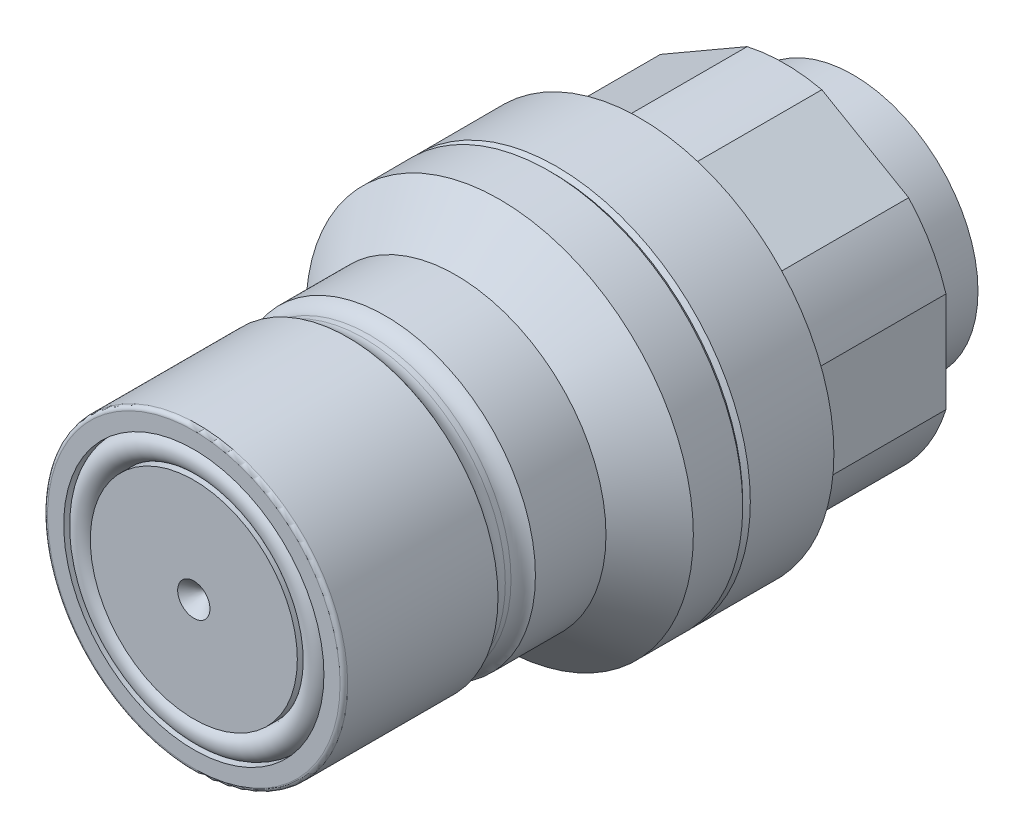
ISO-10303-21;
HEADER;
FILE_DESCRIPTION(('STEP AP214'),'2;1');
FILE_NAME('part.step','',(''),(''),'','','');
FILE_SCHEMA(('AUTOMOTIVE_DESIGN { 1 0 10303 214 1 1 1 1 }'));
ENDSEC;
DATA;
#1=APPLICATION_CONTEXT('core data for automotive mechanical design processes');
#2=APPLICATION_PROTOCOL_DEFINITION('international standard','automotive_design',2000,#1);
#3=PRODUCT_CONTEXT('',#1,'mechanical');
#4=PRODUCT('Part','Part','',(#3));
#5=PRODUCT_RELATED_PRODUCT_CATEGORY('part','',(#4));
#6=PRODUCT_DEFINITION_FORMATION('','',#4);
#7=PRODUCT_DEFINITION_CONTEXT('part definition',#1,'design');
#8=PRODUCT_DEFINITION('design','',#6,#7);
#9=PRODUCT_DEFINITION_SHAPE('','',#8);
#10=(LENGTH_UNIT() NAMED_UNIT(*) SI_UNIT(.MILLI.,.METRE.));
#11=(NAMED_UNIT(*) PLANE_ANGLE_UNIT() SI_UNIT($,.RADIAN.));
#12=(NAMED_UNIT(*) SI_UNIT($,.STERADIAN.) SOLID_ANGLE_UNIT());
#13=UNCERTAINTY_MEASURE_WITH_UNIT(LENGTH_MEASURE(1.E-05),#10,'distance_accuracy_value','');
#14=(GEOMETRIC_REPRESENTATION_CONTEXT(3) GLOBAL_UNCERTAINTY_ASSIGNED_CONTEXT((#13)) GLOBAL_UNIT_ASSIGNED_CONTEXT((#10,
#11,#12)) REPRESENTATION_CONTEXT('',''));
#15=CARTESIAN_POINT('',(0.,0.,0.));
#16=DIRECTION('',(0.,0.,1.));
#17=DIRECTION('',(1.,0.,0.));
#18=AXIS2_PLACEMENT_3D('',#15,#16,#17);
#19=CARTESIAN_POINT('',(0.,0.,7.60000000002492));
#20=DIRECTION('',(0.,0.,-1.));
#21=DIRECTION('',(-1.,0.,0.));
#22=AXIS2_PLACEMENT_3D('',#19,#20,#21);
#23=CONICAL_SURFACE('',#22,3.99999999979173,1.02974425849263);
#24=CARTESIAN_POINT('',(-1.98951966012828E-10,0.,10.0034424765738));
#25=VERTEX_POINT('',#24);
#26=VERTEX_LOOP('',#25);
#27=FACE_BOUND('',#26,.T.);
#28=CARTESIAN_POINT('',(0.,0.,7.6));
#29=DIRECTION('',(0.,0.,-1.));
#30=DIRECTION('',(-1.,0.,0.));
#31=AXIS2_PLACEMENT_3D('',#28,#29,#30);
#32=CIRCLE('',#31,4.);
#33=CARTESIAN_POINT('',(-4.,0.,7.6));
#34=VERTEX_POINT('',#33);
#35=EDGE_CURVE('E183',#34,#34,#32,.T.);
#36=ORIENTED_EDGE('',*,*,#35,.T.);
#37=EDGE_LOOP('',(#36));
#38=FACE_BOUND('',#37,.T.);
#39=ADVANCED_FACE('F18',(#27,#38),#23,.F.);
#40=CARTESIAN_POINT('',(0.,0.,-4.));
#41=DIRECTION('',(0.,0.,-1.));
#42=DIRECTION('',(-1.,0.,0.));
#43=AXIS2_PLACEMENT_3D('',#40,#41,#42);
#44=CYLINDRICAL_SURFACE('',#43,4.);
#45=ORIENTED_EDGE('',*,*,#35,.F.);
#46=EDGE_LOOP('',(#45));
#47=FACE_BOUND('',#46,.T.);
#48=CARTESIAN_POINT('',(0.,0.,-4.));
#49=DIRECTION('',(0.,0.,-1.));
#50=DIRECTION('',(-1.,0.,0.));
#51=AXIS2_PLACEMENT_3D('',#48,#49,#50);
#52=CIRCLE('',#51,4.);
#53=CARTESIAN_POINT('',(-4.,0.,-4.));
#54=VERTEX_POINT('',#53);
#55=EDGE_CURVE('E187',#54,#54,#52,.T.);
#56=ORIENTED_EDGE('',*,*,#55,.T.);
#57=EDGE_LOOP('',(#56));
#58=FACE_BOUND('',#57,.T.);
#59=ADVANCED_FACE('F909',(#47,#58),#44,.F.);
#60=CARTESIAN_POINT('',(0.,5.9,-4.));
#61=DIRECTION('',(0.,0.,1.));
#62=DIRECTION('',(1.,0.,0.));
#63=AXIS2_PLACEMENT_3D('',#60,#61,#62);
#64=PLANE('',#63);
#65=CARTESIAN_POINT('',(0.,0.,-4.0000000000191));
#66=DIRECTION('',(0.,0.,1.));
#67=DIRECTION('',(0.,-1.,0.));
#68=AXIS2_PLACEMENT_3D('',#65,#66,#67);
#69=CIRCLE('',#68,5.89999999994006);
#70=CARTESIAN_POINT('',(0.,-5.89999999994006,-4.0000000000191));
#71=VERTEX_POINT('',#70);
#72=EDGE_CURVE('E182',#71,#71,#69,.T.);
#73=ORIENTED_EDGE('',*,*,#72,.F.);
#74=EDGE_LOOP('',(#73));
#75=FACE_BOUND('',#74,.T.);
#76=ORIENTED_EDGE('',*,*,#55,.F.);
#77=EDGE_LOOP('',(#76));
#78=FACE_BOUND('',#77,.T.);
#79=ADVANCED_FACE('F899',(#75,#78),#64,.F.);
#80=CARTESIAN_POINT('',(0.,0.,-3.60821010730206));
#81=DIRECTION('',(0.,0.,1.));
#82=DIRECTION('',(0.,-1.,0.));
#83=AXIS2_PLACEMENT_3D('',#80,#81,#82);
#84=CONICAL_SURFACE('',#83,6.5785999999548,1.04719755115631);
#85=ORIENTED_EDGE('',*,*,#72,.T.);
#86=EDGE_LOOP('',(#85));
#87=FACE_BOUND('',#86,.T.);
#88=CARTESIAN_POINT('',(0.,0.,-3.60821010732792));
#89=DIRECTION('',(0.,0.,1.));
#90=DIRECTION('',(1.,0.,0.));
#91=AXIS2_PLACEMENT_3D('',#88,#89,#90);
#92=CIRCLE('',#91,6.5786);
#93=CARTESIAN_POINT('',(6.5786,0.,-3.60821010732792));
#94=VERTEX_POINT('',#93);
#95=EDGE_CURVE('E178',#94,#94,#92,.T.);
#96=ORIENTED_EDGE('',*,*,#95,.F.);
#97=EDGE_LOOP('',(#96));
#98=FACE_BOUND('',#97,.T.);
#99=ADVANCED_FACE('F889',(#87,#98),#84,.T.);
#100=CARTESIAN_POINT('',(0.,0.,530.525273429138));
#101=DIRECTION('',(0.,0.,1.));
#102=DIRECTION('',(1.,0.,0.));
#103=AXIS2_PLACEMENT_3D('',#100,#101,#102);
#104=CYLINDRICAL_SURFACE('',#103,6.5786);
#105=ORIENTED_EDGE('',*,*,#95,.T.);
#106=EDGE_LOOP('',(#105));
#107=FACE_BOUND('',#106,.T.);
#108=CARTESIAN_POINT('',(0.,0.,-0.413518792993861));
#109=DIRECTION('',(0.,0.,1.));
#110=DIRECTION('',(-1.,0.,0.));
#111=AXIS2_PLACEMENT_3D('',#108,#109,#110);
#112=CIRCLE('',#111,6.5786);
#113=CARTESIAN_POINT('',(-6.5786,0.,-0.413518792993861));
#114=VERTEX_POINT('',#113);
#115=EDGE_CURVE('E174',#114,#114,#112,.T.);
#116=ORIENTED_EDGE('',*,*,#115,.F.);
#117=EDGE_LOOP('',(#116));
#118=FACE_BOUND('',#117,.T.);
#119=ADVANCED_FACE('F879',(#107,#118),#104,.T.);
#120=CARTESIAN_POINT('',(0.,0.,0.410999999999968));
#121=DIRECTION('',(0.,0.,1.));
#122=DIRECTION('',(1.,0.,0.));
#123=AXIS2_PLACEMENT_3D('',#120,#121,#122);
#124=TOROIDAL_SURFACE('',#123,6.911,0.889);
#125=ORIENTED_EDGE('',*,*,#115,.T.);
#126=EDGE_LOOP('',(#125));
#127=FACE_BOUND('',#126,.T.);
#128=CARTESIAN_POINT('',(0.,0.,0.410999999999939));
#129=DIRECTION('',(0.,0.,1.));
#130=DIRECTION('',(1.,0.,0.));
#131=AXIS2_PLACEMENT_3D('',#128,#129,#130);
#132=CIRCLE('',#131,7.8);
#133=CARTESIAN_POINT('',(7.8,0.,0.410999999999939));
#134=VERTEX_POINT('',#133);
#135=EDGE_CURVE('E170',#134,#134,#132,.F.);
#136=ORIENTED_EDGE('',*,*,#135,.T.);
#137=EDGE_LOOP('',(#136));
#138=FACE_BOUND('',#137,.T.);
#139=ADVANCED_FACE('F869',(#127,#138),#124,.T.);
#140=CARTESIAN_POINT('',(0.,0.,530.525273429138));
#141=DIRECTION('',(0.,0.,1.));
#142=DIRECTION('',(1.,0.,0.));
#143=AXIS2_PLACEMENT_3D('',#140,#141,#142);
#144=CYLINDRICAL_SURFACE('',#143,7.8);
#145=ORIENTED_EDGE('',*,*,#135,.F.);
#146=EDGE_LOOP('',(#145));
#147=FACE_BOUND('',#146,.T.);
#148=CARTESIAN_POINT('',(0.,0.,0.));
#149=DIRECTION('',(0.,0.,1.));
#150=DIRECTION('',(1.,0.,0.));
#151=AXIS2_PLACEMENT_3D('',#148,#149,#150);
#152=CIRCLE('',#151,7.8);
#153=CARTESIAN_POINT('',(7.8,0.,0.));
#154=VERTEX_POINT('',#153);
#155=EDGE_CURVE('E147',#154,#154,#152,.F.);
#156=ORIENTED_EDGE('',*,*,#155,.T.);
#157=EDGE_LOOP('',(#156));
#158=FACE_BOUND('',#157,.T.);
#159=ADVANCED_FACE('F860',(#147,#158),#144,.F.);
#160=CARTESIAN_POINT('',(0.,7.8,0.));
#161=DIRECTION('',(0.,0.,1.));
#162=DIRECTION('',(1.,0.,0.));
#163=AXIS2_PLACEMENT_3D('',#160,#161,#162);
#164=PLANE('',#163);
#165=DIRECTION('',(0.866025403784439,-0.5,0.));
#166=VECTOR('',#165,1.);
#167=CARTESIAN_POINT('',(0.,-9.81495457622364,0.));
#168=LINE('',#167,#166);
#169=CARTESIAN_POINT('',(-6.53473193175916,-6.04212533634045,0.));
#170=VERTEX_POINT('',#169);
#171=CARTESIAN_POINT('',(-1.96526806824084,-8.68030652799502,0.));
#172=VERTEX_POINT('',#171);
#173=EDGE_CURVE('E140',#170,#172,#168,.T.);
#174=ORIENTED_EDGE('',*,*,#173,.F.);
#175=CARTESIAN_POINT('',(0.,0.,0.));
#176=DIRECTION('',(0.,0.,1.));
#177=DIRECTION('',(1.,0.,0.));
#178=AXIS2_PLACEMENT_3D('',#175,#176,#177);
#179=CIRCLE('',#178,8.9);
#180=CARTESIAN_POINT('',(-8.5,-2.63818119165458,0.));
#181=VERTEX_POINT('',#180);
#182=EDGE_CURVE('E263',#181,#170,#179,.T.);
#183=ORIENTED_EDGE('',*,*,#182,.F.);
#184=DIRECTION('',(0.,1.,0.));
#185=VECTOR('',#184,1.);
#186=CARTESIAN_POINT('',(-8.5,-4.90747728811182,0.));
#187=LINE('',#186,#185);
#188=CARTESIAN_POINT('',(-8.5,2.63818119165458,0.));
#189=VERTEX_POINT('',#188);
#190=EDGE_CURVE('E168',#189,#181,#187,.F.);
#191=ORIENTED_EDGE('',*,*,#190,.F.);
#192=CARTESIAN_POINT('',(0.,0.,0.));
#193=DIRECTION('',(0.,0.,1.));
#194=DIRECTION('',(1.,0.,0.));
#195=AXIS2_PLACEMENT_3D('',#192,#193,#194);
#196=CIRCLE('',#195,8.9);
#197=CARTESIAN_POINT('',(-6.53473193175917,6.04212533634044,0.));
#198=VERTEX_POINT('',#197);
#199=EDGE_CURVE('E257',#198,#189,#196,.T.);
#200=ORIENTED_EDGE('',*,*,#199,.F.);
#201=DIRECTION('',(-0.866025403784439,-0.5,0.));
#202=VECTOR('',#201,1.);
#203=CARTESIAN_POINT('',(-8.5,4.90747728811182,0.));
#204=LINE('',#203,#202);
#205=CARTESIAN_POINT('',(-1.96526806824083,8.68030652799502,0.));
#206=VERTEX_POINT('',#205);
#207=EDGE_CURVE('E261',#206,#198,#204,.T.);
#208=ORIENTED_EDGE('',*,*,#207,.F.);
#209=CARTESIAN_POINT('',(0.,0.,0.));
#210=DIRECTION('',(0.,0.,1.));
#211=DIRECTION('',(1.,0.,0.));
#212=AXIS2_PLACEMENT_3D('',#209,#210,#211);
#213=CIRCLE('',#212,8.9);
#214=CARTESIAN_POINT('',(1.96526806824083,8.68030652799502,0.));
#215=VERTEX_POINT('',#214);
#216=EDGE_CURVE('E251',#215,#206,#213,.T.);
#217=ORIENTED_EDGE('',*,*,#216,.F.);
#218=DIRECTION('',(-0.866025403784439,0.5,0.));
#219=VECTOR('',#218,1.);
#220=CARTESIAN_POINT('',(0.,9.81495457622364,0.));
#221=LINE('',#220,#219);
#222=CARTESIAN_POINT('',(6.53473193175917,6.04212533634044,0.));
#223=VERTEX_POINT('',#222);
#224=EDGE_CURVE('E255',#223,#215,#221,.T.);
#225=ORIENTED_EDGE('',*,*,#224,.F.);
#226=CARTESIAN_POINT('',(0.,0.,0.));
#227=DIRECTION('',(0.,0.,1.));
#228=DIRECTION('',(1.,0.,0.));
#229=AXIS2_PLACEMENT_3D('',#226,#227,#228);
#230=CIRCLE('',#229,8.9);
#231=CARTESIAN_POINT('',(8.5,2.63818119165458,0.));
#232=VERTEX_POINT('',#231);
#233=EDGE_CURVE('E245',#232,#223,#230,.T.);
#234=ORIENTED_EDGE('',*,*,#233,.F.);
#235=DIRECTION('',(0.,1.,0.));
#236=VECTOR('',#235,1.);
#237=CARTESIAN_POINT('',(8.5,4.90747728811182,0.));
#238=LINE('',#237,#236);
#239=CARTESIAN_POINT('',(8.5,-2.63818119165458,0.));
#240=VERTEX_POINT('',#239);
#241=EDGE_CURVE('E249',#240,#232,#238,.T.);
#242=ORIENTED_EDGE('',*,*,#241,.F.);
#243=CARTESIAN_POINT('',(0.,0.,0.));
#244=DIRECTION('',(0.,0.,1.));
#245=DIRECTION('',(1.,0.,0.));
#246=AXIS2_PLACEMENT_3D('',#243,#244,#245);
#247=CIRCLE('',#246,8.9);
#248=CARTESIAN_POINT('',(6.53473193175917,-6.04212533634044,0.));
#249=VERTEX_POINT('',#248);
#250=EDGE_CURVE('E239',#249,#240,#247,.T.);
#251=ORIENTED_EDGE('',*,*,#250,.F.);
#252=DIRECTION('',(0.866025403784439,0.5,0.));
#253=VECTOR('',#252,1.);
#254=CARTESIAN_POINT('',(8.5,-4.90747728811182,0.));
#255=LINE('',#254,#253);
#256=CARTESIAN_POINT('',(1.96526806824083,-8.68030652799502,0.));
#257=VERTEX_POINT('',#256);
#258=EDGE_CURVE('E143',#257,#249,#255,.T.);
#259=ORIENTED_EDGE('',*,*,#258,.F.);
#260=CARTESIAN_POINT('',(0.,0.,0.));
#261=DIRECTION('',(0.,0.,1.));
#262=DIRECTION('',(1.,0.,0.));
#263=AXIS2_PLACEMENT_3D('',#260,#261,#262);
#264=CIRCLE('',#263,8.9);
#265=EDGE_CURVE('E135',#172,#257,#264,.T.);
#266=ORIENTED_EDGE('',*,*,#265,.F.);
#267=EDGE_LOOP('',(#174,#183,#191,#200,#208,#217,#225,#234,#242,#251,#259,#266));
#268=FACE_BOUND('',#267,.T.);
#269=ORIENTED_EDGE('',*,*,#155,.F.);
#270=EDGE_LOOP('',(#269));
#271=FACE_BOUND('',#270,.T.);
#272=ADVANCED_FACE('F137',(#268,#271),#164,.F.);
#273=CARTESIAN_POINT('',(0.,0.,530.525273429138));
#274=DIRECTION('',(0.,0.,1.));
#275=DIRECTION('',(1.,0.,0.));
#276=AXIS2_PLACEMENT_3D('',#273,#274,#275);
#277=CYLINDRICAL_SURFACE('',#276,8.9);
#278=DIRECTION('',(0.,0.,1.));
#279=VECTOR('',#278,1.);
#280=CARTESIAN_POINT('',(1.96526806824083,-8.68030652799502,38.2942156255606));
#281=LINE('',#280,#279);
#282=CARTESIAN_POINT('',(1.96526806824083,-8.68030652799502,7.60000000000003));
#283=VERTEX_POINT('',#282);
#284=EDGE_CURVE('E243',#283,#257,#281,.F.);
#285=ORIENTED_EDGE('',*,*,#284,.F.);
#286=CARTESIAN_POINT('',(0.,0.,7.60000000000005));
#287=DIRECTION('',(0.,0.,1.));
#288=DIRECTION('',(1.,0.,0.));
#289=AXIS2_PLACEMENT_3D('',#286,#287,#288);
#290=CIRCLE('',#289,8.9);
#291=CARTESIAN_POINT('',(-1.96526806824085,-8.68030652799501,7.60000000000003));
#292=VERTEX_POINT('',#291);
#293=EDGE_CURVE('E153',#283,#292,#290,.F.);
#294=ORIENTED_EDGE('',*,*,#293,.T.);
#295=DIRECTION('',(0.,0.,1.));
#296=VECTOR('',#295,1.);
#297=CARTESIAN_POINT('',(-1.96526806824084,-8.68030652799502,38.2942156255606));
#298=LINE('',#297,#296);
#299=EDGE_CURVE('E150',#172,#292,#298,.T.);
#300=ORIENTED_EDGE('',*,*,#299,.F.);
#301=ORIENTED_EDGE('',*,*,#265,.T.);
#302=EDGE_LOOP('',(#285,#294,#300,#301));
#303=FACE_BOUND('',#302,.T.);
#304=ADVANCED_FACE('F151',(#303),#277,.T.);
#305=CARTESIAN_POINT('',(0.,-9.81495457622364,38.2942156255606));
#306=DIRECTION('',(-0.5,-0.866025403784439,0.));
#307=DIRECTION('',(0.866025403784439,-0.5,0.));
#308=AXIS2_PLACEMENT_3D('',#305,#306,#307);
#309=PLANE('',#308);
#310=ORIENTED_EDGE('',*,*,#299,.T.);
#311=DIRECTION('',(-0.866025403784438,0.500000000000001,0.));
#312=VECTOR('',#311,1.);
#313=CARTESIAN_POINT('',(-1.96526806824085,-8.68030652799502,7.6));
#314=LINE('',#313,#312);
#315=CARTESIAN_POINT('',(-6.53473193175916,-6.04212533634045,7.60000000000004));
#316=VERTEX_POINT('',#315);
#317=EDGE_CURVE('E235',#292,#316,#314,.T.);
#318=ORIENTED_EDGE('',*,*,#317,.T.);
#319=DIRECTION('',(0.,0.,1.));
#320=VECTOR('',#319,1.);
#321=CARTESIAN_POINT('',(-6.53473193175916,-6.04212533634045,530.525273429138));
#322=LINE('',#321,#320);
#323=EDGE_CURVE('E157',#170,#316,#322,.T.);
#324=ORIENTED_EDGE('',*,*,#323,.F.);
#325=ORIENTED_EDGE('',*,*,#173,.T.);
#326=EDGE_LOOP('',(#310,#318,#324,#325));
#327=FACE_BOUND('',#326,.T.);
#328=ADVANCED_FACE('F159',(#327),#309,.T.);
#329=CARTESIAN_POINT('',(0.,0.,530.525273429138));
#330=DIRECTION('',(0.,0.,1.));
#331=DIRECTION('',(1.,0.,0.));
#332=AXIS2_PLACEMENT_3D('',#329,#330,#331);
#333=CYLINDRICAL_SURFACE('',#332,8.9);
#334=DIRECTION('',(0.,0.,1.));
#335=VECTOR('',#334,1.);
#336=CARTESIAN_POINT('',(-8.5,-2.63818119165457,38.2942156255606));
#337=LINE('',#336,#335);
#338=CARTESIAN_POINT('',(-8.5,-2.63818119165458,7.60000000000003));
#339=VERTEX_POINT('',#338);
#340=EDGE_CURVE('E382',#181,#339,#337,.T.);
#341=ORIENTED_EDGE('',*,*,#340,.F.);
#342=ORIENTED_EDGE('',*,*,#182,.T.);
#343=ORIENTED_EDGE('',*,*,#323,.T.);
#344=CARTESIAN_POINT('',(0.,0.,7.60000000000005));
#345=DIRECTION('',(0.,0.,1.));
#346=DIRECTION('',(1.,0.,0.));
#347=AXIS2_PLACEMENT_3D('',#344,#345,#346);
#348=CIRCLE('',#347,8.9);
#349=EDGE_CURVE('E232',#316,#339,#348,.F.);
#350=ORIENTED_EDGE('',*,*,#349,.T.);
#351=EDGE_LOOP('',(#341,#342,#343,#350));
#352=FACE_BOUND('',#351,.T.);
#353=ADVANCED_FACE('F437',(#352),#333,.T.);
#354=CARTESIAN_POINT('',(-8.5,-4.90747728811182,38.2942156255606));
#355=DIRECTION('',(-1.,0.,0.));
#356=DIRECTION('',(0.,0.,1.));
#357=AXIS2_PLACEMENT_3D('',#354,#355,#356);
#358=PLANE('',#357);
#359=ORIENTED_EDGE('',*,*,#340,.T.);
#360=DIRECTION('',(0.,1.,0.));
#361=VECTOR('',#360,1.);
#362=CARTESIAN_POINT('',(-8.5,8.9,7.6));
#363=LINE('',#362,#361);
#364=CARTESIAN_POINT('',(-8.5,2.63818119165458,7.60000000000004));
#365=VERTEX_POINT('',#364);
#366=EDGE_CURVE('E231',#339,#365,#363,.T.);
#367=ORIENTED_EDGE('',*,*,#366,.T.);
#368=DIRECTION('',(0.,0.,1.));
#369=VECTOR('',#368,1.);
#370=CARTESIAN_POINT('',(-8.5,2.63818119165458,530.525273429138));
#371=LINE('',#370,#369);
#372=EDGE_CURVE('E262',#189,#365,#371,.T.);
#373=ORIENTED_EDGE('',*,*,#372,.F.);
#374=ORIENTED_EDGE('',*,*,#190,.T.);
#375=EDGE_LOOP('',(#359,#367,#373,#374));
#376=FACE_BOUND('',#375,.T.);
#377=ADVANCED_FACE('F439',(#376),#358,.T.);
#378=CARTESIAN_POINT('',(0.,0.,530.525273429138));
#379=DIRECTION('',(0.,0.,1.));
#380=DIRECTION('',(1.,0.,0.));
#381=AXIS2_PLACEMENT_3D('',#378,#379,#380);
#382=CYLINDRICAL_SURFACE('',#381,8.9);
#383=DIRECTION('',(0.,0.,1.));
#384=VECTOR('',#383,1.);
#385=CARTESIAN_POINT('',(-6.53473193175916,6.04212533634044,38.2942156255606));
#386=LINE('',#385,#384);
#387=CARTESIAN_POINT('',(-6.53473193175916,6.04212533634045,7.60000000000003));
#388=VERTEX_POINT('',#387);
#389=EDGE_CURVE('E375',#198,#388,#386,.T.);
#390=ORIENTED_EDGE('',*,*,#389,.F.);
#391=ORIENTED_EDGE('',*,*,#199,.T.);
#392=ORIENTED_EDGE('',*,*,#372,.T.);
#393=CARTESIAN_POINT('',(0.,0.,7.60000000000005));
#394=DIRECTION('',(0.,0.,1.));
#395=DIRECTION('',(1.,0.,0.));
#396=AXIS2_PLACEMENT_3D('',#393,#394,#395);
#397=CIRCLE('',#396,8.9);
#398=EDGE_CURVE('E228',#365,#388,#397,.F.);
#399=ORIENTED_EDGE('',*,*,#398,.T.);
#400=EDGE_LOOP('',(#390,#391,#392,#399));
#401=FACE_BOUND('',#400,.T.);
#402=ADVANCED_FACE('F405',(#401),#382,.T.);
#403=CARTESIAN_POINT('',(-8.5,4.90747728811182,38.2942156255606));
#404=DIRECTION('',(-0.5,0.866025403784439,0.));
#405=DIRECTION('',(-0.866025403784439,-0.5,0.));
#406=AXIS2_PLACEMENT_3D('',#403,#404,#405);
#407=PLANE('',#406);
#408=ORIENTED_EDGE('',*,*,#389,.T.);
#409=DIRECTION('',(0.866025403784439,0.5,0.));
#410=VECTOR('',#409,1.);
#411=CARTESIAN_POINT('',(-6.53473193175916,6.04212533634045,7.6));
#412=LINE('',#411,#410);
#413=CARTESIAN_POINT('',(-1.96526806824083,8.68030652799502,7.60000000000004));
#414=VERTEX_POINT('',#413);
#415=EDGE_CURVE('E227',#388,#414,#412,.T.);
#416=ORIENTED_EDGE('',*,*,#415,.T.);
#417=DIRECTION('',(0.,0.,1.));
#418=VECTOR('',#417,1.);
#419=CARTESIAN_POINT('',(-1.96526806824083,8.68030652799502,530.525273429138));
#420=LINE('',#419,#418);
#421=EDGE_CURVE('E256',#206,#414,#420,.T.);
#422=ORIENTED_EDGE('',*,*,#421,.F.);
#423=ORIENTED_EDGE('',*,*,#207,.T.);
#424=EDGE_LOOP('',(#408,#416,#422,#423));
#425=FACE_BOUND('',#424,.T.);
#426=ADVANCED_FACE('F398',(#425),#407,.T.);
#427=CARTESIAN_POINT('',(0.,0.,530.525273429138));
#428=DIRECTION('',(0.,0.,1.));
#429=DIRECTION('',(1.,0.,0.));
#430=AXIS2_PLACEMENT_3D('',#427,#428,#429);
#431=CYLINDRICAL_SURFACE('',#430,8.9);
#432=DIRECTION('',(0.,0.,1.));
#433=VECTOR('',#432,1.);
#434=CARTESIAN_POINT('',(1.96526806824083,8.68030652799502,38.2942156255606));
#435=LINE('',#434,#433);
#436=CARTESIAN_POINT('',(1.96526806824083,8.68030652799502,7.60000000000003));
#437=VERTEX_POINT('',#436);
#438=EDGE_CURVE('E368',#215,#437,#435,.T.);
#439=ORIENTED_EDGE('',*,*,#438,.F.);
#440=ORIENTED_EDGE('',*,*,#216,.T.);
#441=ORIENTED_EDGE('',*,*,#421,.T.);
#442=CARTESIAN_POINT('',(0.,0.,7.60000000000005));
#443=DIRECTION('',(0.,0.,1.));
#444=DIRECTION('',(1.,0.,0.));
#445=AXIS2_PLACEMENT_3D('',#442,#443,#444);
#446=CIRCLE('',#445,8.9);
#447=EDGE_CURVE('E224',#414,#437,#446,.F.);
#448=ORIENTED_EDGE('',*,*,#447,.T.);
#449=EDGE_LOOP('',(#439,#440,#441,#448));
#450=FACE_BOUND('',#449,.T.);
#451=ADVANCED_FACE('F415',(#450),#431,.T.);
#452=CARTESIAN_POINT('',(0.,9.81495457622364,38.2942156255606));
#453=DIRECTION('',(0.5,0.866025403784439,0.));
#454=DIRECTION('',(-0.866025403784439,0.5,0.));
#455=AXIS2_PLACEMENT_3D('',#452,#453,#454);
#456=PLANE('',#455);
#457=ORIENTED_EDGE('',*,*,#438,.T.);
#458=DIRECTION('',(0.866025403784439,-0.5,0.));
#459=VECTOR('',#458,1.);
#460=CARTESIAN_POINT('',(1.96526806824084,8.68030652799502,7.6));
#461=LINE('',#460,#459);
#462=CARTESIAN_POINT('',(6.53473193175917,6.04212533634044,7.60000000000004));
#463=VERTEX_POINT('',#462);
#464=EDGE_CURVE('E223',#437,#463,#461,.T.);
#465=ORIENTED_EDGE('',*,*,#464,.T.);
#466=DIRECTION('',(0.,0.,1.));
#467=VECTOR('',#466,1.);
#468=CARTESIAN_POINT('',(6.53473193175917,6.04212533634044,530.525273429138));
#469=LINE('',#468,#467);
#470=EDGE_CURVE('E250',#223,#463,#469,.T.);
#471=ORIENTED_EDGE('',*,*,#470,.F.);
#472=ORIENTED_EDGE('',*,*,#224,.T.);
#473=EDGE_LOOP('',(#457,#465,#471,#472));
#474=FACE_BOUND('',#473,.T.);
#475=ADVANCED_FACE('F418',(#474),#456,.T.);
#476=CARTESIAN_POINT('',(0.,0.,530.525273429138));
#477=DIRECTION('',(0.,0.,1.));
#478=DIRECTION('',(1.,0.,0.));
#479=AXIS2_PLACEMENT_3D('',#476,#477,#478);
#480=CYLINDRICAL_SURFACE('',#479,8.9);
#481=DIRECTION('',(0.,0.,1.));
#482=VECTOR('',#481,1.);
#483=CARTESIAN_POINT('',(8.5,2.63818119165457,38.2942156255606));
#484=LINE('',#483,#482);
#485=CARTESIAN_POINT('',(8.5,2.63818119165458,7.60000000000003));
#486=VERTEX_POINT('',#485);
#487=EDGE_CURVE('E361',#232,#486,#484,.T.);
#488=ORIENTED_EDGE('',*,*,#487,.F.);
#489=ORIENTED_EDGE('',*,*,#233,.T.);
#490=ORIENTED_EDGE('',*,*,#470,.T.);
#491=CARTESIAN_POINT('',(0.,0.,7.60000000000005));
#492=DIRECTION('',(0.,0.,1.));
#493=DIRECTION('',(1.,0.,0.));
#494=AXIS2_PLACEMENT_3D('',#491,#492,#493);
#495=CIRCLE('',#494,8.9);
#496=EDGE_CURVE('E220',#463,#486,#495,.F.);
#497=ORIENTED_EDGE('',*,*,#496,.T.);
#498=EDGE_LOOP('',(#488,#489,#490,#497));
#499=FACE_BOUND('',#498,.T.);
#500=ADVANCED_FACE('F422',(#499),#480,.T.);
#501=CARTESIAN_POINT('',(8.5,4.90747728811182,38.2942156255606));
#502=DIRECTION('',(1.,0.,0.));
#503=DIRECTION('',(0.,1.,0.));
#504=AXIS2_PLACEMENT_3D('',#501,#502,#503);
#505=PLANE('',#504);
#506=ORIENTED_EDGE('',*,*,#487,.T.);
#507=DIRECTION('',(0.,1.,0.));
#508=VECTOR('',#507,1.);
#509=CARTESIAN_POINT('',(8.5,8.9,7.6));
#510=LINE('',#509,#508);
#511=CARTESIAN_POINT('',(8.5,-2.63818119165458,7.60000000000004));
#512=VERTEX_POINT('',#511);
#513=EDGE_CURVE('E219',#486,#512,#510,.F.);
#514=ORIENTED_EDGE('',*,*,#513,.T.);
#515=DIRECTION('',(0.,0.,1.));
#516=VECTOR('',#515,1.);
#517=CARTESIAN_POINT('',(8.5,-2.63818119165458,530.525273429138));
#518=LINE('',#517,#516);
#519=EDGE_CURVE('E244',#240,#512,#518,.T.);
#520=ORIENTED_EDGE('',*,*,#519,.F.);
#521=ORIENTED_EDGE('',*,*,#241,.T.);
#522=EDGE_LOOP('',(#506,#514,#520,#521));
#523=FACE_BOUND('',#522,.T.);
#524=ADVANCED_FACE('F426',(#523),#505,.T.);
#525=CARTESIAN_POINT('',(0.,0.,530.525273429138));
#526=DIRECTION('',(0.,0.,1.));
#527=DIRECTION('',(1.,0.,0.));
#528=AXIS2_PLACEMENT_3D('',#525,#526,#527);
#529=CYLINDRICAL_SURFACE('',#528,8.9);
#530=DIRECTION('',(0.,0.,1.));
#531=VECTOR('',#530,1.);
#532=CARTESIAN_POINT('',(6.53473193175916,-6.04212533634044,38.2942156255606));
#533=LINE('',#532,#531);
#534=CARTESIAN_POINT('',(6.53473193175916,-6.04212533634045,7.60000000000003));
#535=VERTEX_POINT('',#534);
#536=EDGE_CURVE('E238',#249,#535,#533,.T.);
#537=ORIENTED_EDGE('',*,*,#536,.F.);
#538=ORIENTED_EDGE('',*,*,#250,.T.);
#539=ORIENTED_EDGE('',*,*,#519,.T.);
#540=CARTESIAN_POINT('',(0.,0.,7.60000000000005));
#541=DIRECTION('',(0.,0.,1.));
#542=DIRECTION('',(1.,0.,0.));
#543=AXIS2_PLACEMENT_3D('',#540,#541,#542);
#544=CIRCLE('',#543,8.9);
#545=EDGE_CURVE('E216',#512,#535,#544,.F.);
#546=ORIENTED_EDGE('',*,*,#545,.T.);
#547=EDGE_LOOP('',(#537,#538,#539,#546));
#548=FACE_BOUND('',#547,.T.);
#549=ADVANCED_FACE('F429',(#548),#529,.T.);
#550=CARTESIAN_POINT('',(8.5,-4.90747728811182,38.2942156255606));
#551=DIRECTION('',(0.5,-0.866025403784439,0.));
#552=DIRECTION('',(0.866025403784439,0.5,0.));
#553=AXIS2_PLACEMENT_3D('',#550,#551,#552);
#554=PLANE('',#553);
#555=ORIENTED_EDGE('',*,*,#536,.T.);
#556=DIRECTION('',(-0.866025403784439,-0.499999999999999,0.));
#557=VECTOR('',#556,1.);
#558=CARTESIAN_POINT('',(6.53473193175916,-6.04212533634045,7.6));
#559=LINE('',#558,#557);
#560=EDGE_CURVE('E215',#535,#283,#559,.T.);
#561=ORIENTED_EDGE('',*,*,#560,.T.);
#562=ORIENTED_EDGE('',*,*,#284,.T.);
#563=ORIENTED_EDGE('',*,*,#258,.T.);
#564=EDGE_LOOP('',(#555,#561,#562,#563));
#565=FACE_BOUND('',#564,.T.);
#566=ADVANCED_FACE('F432',(#565),#554,.T.);
#567=CARTESIAN_POINT('',(0.,8.9,7.6));
#568=DIRECTION('',(0.,0.,1.));
#569=DIRECTION('',(1.,0.,0.));
#570=AXIS2_PLACEMENT_3D('',#567,#568,#569);
#571=PLANE('',#570);
#572=CARTESIAN_POINT('',(0.,0.,7.60000000000005));
#573=DIRECTION('',(0.,0.,1.));
#574=DIRECTION('',(1.,0.,0.));
#575=AXIS2_PLACEMENT_3D('',#572,#573,#574);
#576=CIRCLE('',#575,10.2);
#577=CARTESIAN_POINT('',(10.2,0.,7.60000000000005));
#578=VERTEX_POINT('',#577);
#579=EDGE_CURVE('E210',#578,#578,#576,.T.);
#580=ORIENTED_EDGE('',*,*,#579,.F.);
#581=EDGE_LOOP('',(#580));
#582=FACE_BOUND('',#581,.T.);
#583=ORIENTED_EDGE('',*,*,#545,.F.);
#584=ORIENTED_EDGE('',*,*,#513,.F.);
#585=ORIENTED_EDGE('',*,*,#496,.F.);
#586=ORIENTED_EDGE('',*,*,#464,.F.);
#587=ORIENTED_EDGE('',*,*,#447,.F.);
#588=ORIENTED_EDGE('',*,*,#415,.F.);
#589=ORIENTED_EDGE('',*,*,#398,.F.);
#590=ORIENTED_EDGE('',*,*,#366,.F.);
#591=ORIENTED_EDGE('',*,*,#349,.F.);
#592=ORIENTED_EDGE('',*,*,#317,.F.);
#593=ORIENTED_EDGE('',*,*,#293,.F.);
#594=ORIENTED_EDGE('',*,*,#560,.F.);
#595=EDGE_LOOP('',(#583,#584,#585,#586,#587,#588,#589,#590,#591,#592,#593,#594));
#596=FACE_BOUND('',#595,.T.);
#597=ADVANCED_FACE('F410',(#582,#596),#571,.F.);
#598=CARTESIAN_POINT('',(0.,0.,530.525273429138));
#599=DIRECTION('',(0.,0.,1.));
#600=DIRECTION('',(1.,0.,0.));
#601=AXIS2_PLACEMENT_3D('',#598,#599,#600);
#602=CYLINDRICAL_SURFACE('',#601,10.2);
#603=ORIENTED_EDGE('',*,*,#579,.T.);
#604=EDGE_LOOP('',(#603));
#605=FACE_BOUND('',#604,.T.);
#606=CARTESIAN_POINT('',(0.,0.,12.));
#607=DIRECTION('',(0.,0.,-1.));
#608=DIRECTION('',(-1.,0.,0.));
#609=AXIS2_PLACEMENT_3D('',#606,#607,#608);
#610=CIRCLE('',#609,10.2);
#611=CARTESIAN_POINT('',(-10.2,0.,12.));
#612=VERTEX_POINT('',#611);
#613=EDGE_CURVE('E214',#612,#612,#610,.F.);
#614=ORIENTED_EDGE('',*,*,#613,.F.);
#615=EDGE_LOOP('',(#614));
#616=FACE_BOUND('',#615,.T.);
#617=ADVANCED_FACE('F512',(#605,#616),#602,.T.);
#618=CARTESIAN_POINT('',(0.,0.,12.));
#619=DIRECTION('',(0.,0.,-1.));
#620=DIRECTION('',(-1.,0.,0.));
#621=AXIS2_PLACEMENT_3D('',#618,#619,#620);
#622=CONICAL_SURFACE('',#621,10.2,0.7853981633975);
#623=CARTESIAN_POINT('',(0.,0.,12.2));
#624=DIRECTION('',(0.,0.,1.));
#625=DIRECTION('',(0.,-1.,0.));
#626=AXIS2_PLACEMENT_3D('',#623,#624,#625);
#627=CIRCLE('',#626,10.);
#628=CARTESIAN_POINT('',(0.,-10.,12.2));
#629=VERTEX_POINT('',#628);
#630=EDGE_CURVE('E331',#629,#629,#627,.T.);
#631=ORIENTED_EDGE('',*,*,#630,.F.);
#632=EDGE_LOOP('',(#631));
#633=FACE_BOUND('',#632,.T.);
#634=ORIENTED_EDGE('',*,*,#613,.T.);
#635=EDGE_LOOP('',(#634));
#636=FACE_BOUND('',#635,.T.);
#637=ADVANCED_FACE('F508',(#633,#636),#622,.T.);
#638=CARTESIAN_POINT('',(0.,0.,12.4));
#639=DIRECTION('',(0.,0.,1.));
#640=DIRECTION('',(1.,0.,0.));
#641=AXIS2_PLACEMENT_3D('',#638,#639,#640);
#642=CONICAL_SURFACE('',#641,10.2,0.785398163397505);
#643=CARTESIAN_POINT('',(0.,0.,12.4));
#644=DIRECTION('',(0.,0.,1.));
#645=DIRECTION('',(1.,0.,0.));
#646=AXIS2_PLACEMENT_3D('',#643,#644,#645);
#647=CIRCLE('',#646,10.2);
#648=CARTESIAN_POINT('',(10.2,0.,12.4));
#649=VERTEX_POINT('',#648);
#650=EDGE_CURVE('E209',#649,#649,#647,.T.);
#651=ORIENTED_EDGE('',*,*,#650,.F.);
#652=EDGE_LOOP('',(#651));
#653=FACE_BOUND('',#652,.T.);
#654=ORIENTED_EDGE('',*,*,#630,.T.);
#655=EDGE_LOOP('',(#654));
#656=FACE_BOUND('',#655,.T.);
#657=ADVANCED_FACE('F505',(#653,#656),#642,.T.);
#658=CARTESIAN_POINT('',(0.,0.,31.0999999999808));
#659=DIRECTION('',(0.,0.,1.));
#660=DIRECTION('',(1.,0.,0.));
#661=AXIS2_PLACEMENT_3D('',#658,#659,#660);
#662=CONICAL_SURFACE('',#661,0.85000000007085,0.785398163263699);
#663=CARTESIAN_POINT('',(0.,5.6843418860808E-11,30.2499999999384));
#664=VERTEX_POINT('',#663);
#665=VERTEX_LOOP('',#664);
#666=FACE_BOUND('',#665,.T.);
#667=CARTESIAN_POINT('',(0.,0.,31.099999999924));
#668=DIRECTION('',(0.,0.,1.));
#669=DIRECTION('',(1.,0.,0.));
#670=AXIS2_PLACEMENT_3D('',#667,#668,#669);
#671=CIRCLE('',#670,0.850000000014006);
#672=CARTESIAN_POINT('',(0.850000000014006,0.,31.099999999924));
#673=VERTEX_POINT('',#672);
#674=EDGE_CURVE('E205',#673,#673,#671,.T.);
#675=ORIENTED_EDGE('',*,*,#674,.T.);
#676=EDGE_LOOP('',(#675));
#677=FACE_BOUND('',#676,.T.);
#678=ADVANCED_FACE('F501',(#666,#677),#662,.F.);
#679=CARTESIAN_POINT('',(0.,0.,530.525273429138));
#680=DIRECTION('',(0.,0.,1.));
#681=DIRECTION('',(1.,0.,0.));
#682=AXIS2_PLACEMENT_3D('',#679,#680,#681);
#683=CYLINDRICAL_SURFACE('',#682,10.2);
#684=CARTESIAN_POINT('',(0.,0.,15.));
#685=DIRECTION('',(0.,0.,-1.));
#686=DIRECTION('',(-1.,0.,0.));
#687=AXIS2_PLACEMENT_3D('',#684,#685,#686);
#688=CIRCLE('',#687,10.2);
#689=CARTESIAN_POINT('',(-10.2,0.,15.));
#690=VERTEX_POINT('',#689);
#691=EDGE_CURVE('E204',#690,#690,#688,.F.);
#692=ORIENTED_EDGE('',*,*,#691,.F.);
#693=EDGE_LOOP('',(#692));
#694=FACE_BOUND('',#693,.T.);
#695=ORIENTED_EDGE('',*,*,#650,.T.);
#696=EDGE_LOOP('',(#695));
#697=FACE_BOUND('',#696,.T.);
#698=ADVANCED_FACE('F497',(#694,#697),#683,.T.);
#699=CARTESIAN_POINT('',(0.,5.45,31.1));
#700=DIRECTION('',(0.,0.,-1.));
#701=DIRECTION('',(-1.,0.,0.));
#702=AXIS2_PLACEMENT_3D('',#699,#700,#701);
#703=PLANE('',#702);
#704=CARTESIAN_POINT('',(0.,0.,31.1));
#705=DIRECTION('',(0.,0.,1.));
#706=DIRECTION('',(1.,0.,0.));
#707=AXIS2_PLACEMENT_3D('',#704,#705,#706);
#708=CIRCLE('',#707,5.45);
#709=CARTESIAN_POINT('',(5.45,0.,31.1));
#710=VERTEX_POINT('',#709);
#711=EDGE_CURVE('E199',#710,#710,#708,.F.);
#712=ORIENTED_EDGE('',*,*,#711,.F.);
#713=EDGE_LOOP('',(#712));
#714=FACE_BOUND('',#713,.T.);
#715=ORIENTED_EDGE('',*,*,#674,.F.);
#716=EDGE_LOOP('',(#715));
#717=FACE_BOUND('',#716,.T.);
#718=ADVANCED_FACE('F493',(#714,#717),#703,.F.);
#719=CARTESIAN_POINT('',(0.,0.,15.));
#720=DIRECTION('',(0.,0.,-1.));
#721=DIRECTION('',(-1.,0.,0.));
#722=AXIS2_PLACEMENT_3D('',#719,#720,#721);
#723=CONICAL_SURFACE('',#722,10.2,0.785398163397454);
#724=ORIENTED_EDGE('',*,*,#691,.T.);
#725=EDGE_LOOP('',(#724));
#726=FACE_BOUND('',#725,.T.);
#727=CARTESIAN_POINT('',(0.,0.,17.3));
#728=DIRECTION('',(0.,0.,1.));
#729=DIRECTION('',(1.,0.,0.));
#730=AXIS2_PLACEMENT_3D('',#727,#728,#729);
#731=CIRCLE('',#730,7.9);
#732=CARTESIAN_POINT('',(7.9,0.,17.3));
#733=VERTEX_POINT('',#732);
#734=EDGE_CURVE('E203',#733,#733,#731,.T.);
#735=ORIENTED_EDGE('',*,*,#734,.F.);
#736=EDGE_LOOP('',(#735));
#737=FACE_BOUND('',#736,.T.);
#738=ADVANCED_FACE('F489',(#726,#737),#723,.T.);
#739=CARTESIAN_POINT('',(0.,0.,530.525273429138));
#740=DIRECTION('',(0.,0.,1.));
#741=DIRECTION('',(1.,0.,0.));
#742=AXIS2_PLACEMENT_3D('',#739,#740,#741);
#743=CYLINDRICAL_SURFACE('',#742,5.45);
#744=ORIENTED_EDGE('',*,*,#711,.T.);
#745=EDGE_LOOP('',(#744));
#746=FACE_BOUND('',#745,.T.);
#747=CARTESIAN_POINT('',(0.,0.,30.5));
#748=DIRECTION('',(0.,0.,-1.));
#749=DIRECTION('',(1.,0.,0.));
#750=AXIS2_PLACEMENT_3D('',#747,#748,#749);
#751=CIRCLE('',#750,5.45);
#752=CARTESIAN_POINT('',(5.45,0.,30.5));
#753=VERTEX_POINT('',#752);
#754=EDGE_CURVE('E315',#753,#753,#751,.T.);
#755=ORIENTED_EDGE('',*,*,#754,.F.);
#756=EDGE_LOOP('',(#755));
#757=FACE_BOUND('',#756,.T.);
#758=ADVANCED_FACE('F485',(#746,#757),#743,.T.);
#759=CARTESIAN_POINT('',(0.,0.,530.525273429138));
#760=DIRECTION('',(0.,0.,1.));
#761=DIRECTION('',(1.,0.,0.));
#762=AXIS2_PLACEMENT_3D('',#759,#760,#761);
#763=CYLINDRICAL_SURFACE('',#762,7.9);
#764=CARTESIAN_POINT('',(0.,0.,21.0148353455755));
#765=DIRECTION('',(0.,0.,-1.));
#766=DIRECTION('',(1.,0.,0.));
#767=AXIS2_PLACEMENT_3D('',#764,#765,#766);
#768=CIRCLE('',#767,7.90000000000002);
#769=CARTESIAN_POINT('',(7.90000000000002,0.,21.0148353455755));
#770=VERTEX_POINT('',#769);
#771=EDGE_CURVE('E311',#770,#770,#768,.T.);
#772=ORIENTED_EDGE('',*,*,#771,.T.);
#773=EDGE_LOOP('',(#772));
#774=FACE_BOUND('',#773,.T.);
#775=ORIENTED_EDGE('',*,*,#734,.T.);
#776=EDGE_LOOP('',(#775));
#777=FACE_BOUND('',#776,.T.);
#778=ADVANCED_FACE('F481',(#774,#777),#763,.T.);
#779=CARTESIAN_POINT('',(0.,0.,30.5));
#780=DIRECTION('',(0.,0.,1.));
#781=DIRECTION('',(1.,0.,0.));
#782=AXIS2_PLACEMENT_3D('',#779,#780,#781);
#783=TOROIDAL_SURFACE('',#782,6.15,0.7);
#784=ORIENTED_EDGE('',*,*,#754,.T.);
#785=EDGE_LOOP('',(#784));
#786=FACE_BOUND('',#785,.T.);
#787=CARTESIAN_POINT('',(0.,0.,30.5));
#788=DIRECTION('',(0.,0.,1.));
#789=DIRECTION('',(1.,0.,0.));
#790=AXIS2_PLACEMENT_3D('',#787,#788,#789);
#791=CIRCLE('',#790,6.85);
#792=CARTESIAN_POINT('',(6.85,0.,30.5));
#793=VERTEX_POINT('',#792);
#794=EDGE_CURVE('E310',#793,#793,#791,.T.);
#795=ORIENTED_EDGE('',*,*,#794,.T.);
#796=EDGE_LOOP('',(#795));
#797=FACE_BOUND('',#796,.T.);
#798=ADVANCED_FACE('F484',(#786,#797),#783,.T.);
#799=CARTESIAN_POINT('',(0.,0.,21.85));
#800=DIRECTION('',(0.,0.,1.));
#801=DIRECTION('',(1.,0.,0.));
#802=AXIS2_PLACEMENT_3D('',#799,#800,#801);
#803=TOROIDAL_SURFACE('',#802,8.45,0.999999999999999);
#804=CARTESIAN_POINT('',(0.,0.,21.85));
#805=DIRECTION('',(0.,0.,1.));
#806=DIRECTION('',(1.,0.,0.));
#807=AXIS2_PLACEMENT_3D('',#804,#805,#806);
#808=CIRCLE('',#807,7.45);
#809=CARTESIAN_POINT('',(7.45,0.,21.85));
#810=VERTEX_POINT('',#809);
#811=EDGE_CURVE('E198',#810,#810,#808,.T.);
#812=ORIENTED_EDGE('',*,*,#811,.F.);
#813=EDGE_LOOP('',(#812));
#814=FACE_BOUND('',#813,.T.);
#815=ORIENTED_EDGE('',*,*,#771,.F.);
#816=EDGE_LOOP('',(#815));
#817=FACE_BOUND('',#816,.T.);
#818=ADVANCED_FACE('F479',(#814,#817),#803,.F.);
#819=CARTESIAN_POINT('',(0.,0.,530.525273429138));
#820=DIRECTION('',(0.,0.,1.));
#821=DIRECTION('',(1.,0.,0.));
#822=AXIS2_PLACEMENT_3D('',#819,#820,#821);
#823=CYLINDRICAL_SURFACE('',#822,6.85);
#824=ORIENTED_EDGE('',*,*,#794,.F.);
#825=EDGE_LOOP('',(#824));
#826=FACE_BOUND('',#825,.T.);
#827=CARTESIAN_POINT('',(0.,0.,31.1));
#828=DIRECTION('',(0.,0.,1.));
#829=DIRECTION('',(1.,0.,0.));
#830=AXIS2_PLACEMENT_3D('',#827,#828,#829);
#831=CIRCLE('',#830,6.85);
#832=CARTESIAN_POINT('',(6.85,0.,31.1));
#833=VERTEX_POINT('',#832);
#834=EDGE_CURVE('E194',#833,#833,#831,.T.);
#835=ORIENTED_EDGE('',*,*,#834,.T.);
#836=EDGE_LOOP('',(#835));
#837=FACE_BOUND('',#836,.T.);
#838=ADVANCED_FACE('F475',(#826,#837),#823,.F.);
#839=CARTESIAN_POINT('',(0.,0.,530.525273429138));
#840=DIRECTION('',(0.,0.,1.));
#841=DIRECTION('',(1.,0.,0.));
#842=AXIS2_PLACEMENT_3D('',#839,#840,#841);
#843=CYLINDRICAL_SURFACE('',#842,7.45);
#844=CARTESIAN_POINT('',(0.,0.,22.15));
#845=DIRECTION('',(0.,0.,-1.));
#846=DIRECTION('',(1.,0.,0.));
#847=AXIS2_PLACEMENT_3D('',#844,#845,#846);
#848=CIRCLE('',#847,7.45);
#849=CARTESIAN_POINT('',(7.45,0.,22.15));
#850=VERTEX_POINT('',#849);
#851=EDGE_CURVE('E193',#850,#850,#848,.T.);
#852=ORIENTED_EDGE('',*,*,#851,.T.);
#853=EDGE_LOOP('',(#852));
#854=FACE_BOUND('',#853,.T.);
#855=ORIENTED_EDGE('',*,*,#811,.T.);
#856=EDGE_LOOP('',(#855));
#857=FACE_BOUND('',#856,.T.);
#858=ADVANCED_FACE('F471',(#854,#857),#843,.T.);
#859=CARTESIAN_POINT('',(0.,7.7,31.1));
#860=DIRECTION('',(0.,0.,-1.));
#861=DIRECTION('',(-1.,0.,0.));
#862=AXIS2_PLACEMENT_3D('',#859,#860,#861);
#863=PLANE('',#862);
#864=CARTESIAN_POINT('',(0.,0.,31.1));
#865=DIRECTION('',(0.,0.,1.));
#866=DIRECTION('',(1.,0.,0.));
#867=AXIS2_PLACEMENT_3D('',#864,#865,#866);
#868=CIRCLE('',#867,7.7);
#869=CARTESIAN_POINT('',(7.7,0.,31.1));
#870=VERTEX_POINT('',#869);
#871=EDGE_CURVE('E189',#870,#870,#868,.F.);
#872=ORIENTED_EDGE('',*,*,#871,.F.);
#873=EDGE_LOOP('',(#872));
#874=FACE_BOUND('',#873,.T.);
#875=ORIENTED_EDGE('',*,*,#834,.F.);
#876=EDGE_LOOP('',(#875));
#877=FACE_BOUND('',#876,.T.);
#878=ADVANCED_FACE('F468',(#874,#877),#863,.F.);
#879=CARTESIAN_POINT('',(0.,0.,22.15));
#880=DIRECTION('',(0.,0.,1.));
#881=DIRECTION('',(0.,-1.,0.));
#882=AXIS2_PLACEMENT_3D('',#879,#880,#881);
#883=TOROIDAL_SURFACE('',#882,8.45000000000001,1.00000000000001);
#884=CARTESIAN_POINT('',(0.,0.,22.9851646544245));
#885=DIRECTION('',(0.,0.,1.));
#886=DIRECTION('',(1.,0.,0.));
#887=AXIS2_PLACEMENT_3D('',#884,#885,#886);
#888=CIRCLE('',#887,7.9);
#889=CARTESIAN_POINT('',(7.9,0.,22.9851646544245));
#890=VERTEX_POINT('',#889);
#891=EDGE_CURVE('E29',#890,#890,#888,.T.);
#892=ORIENTED_EDGE('',*,*,#891,.F.);
#893=EDGE_LOOP('',(#892));
#894=FACE_BOUND('',#893,.T.);
#895=ORIENTED_EDGE('',*,*,#851,.F.);
#896=EDGE_LOOP('',(#895));
#897=FACE_BOUND('',#896,.T.);
#898=ADVANCED_FACE('F461',(#894,#897),#883,.F.);
#899=CARTESIAN_POINT('',(0.,0.,30.9));
#900=DIRECTION('',(0.,0.,1.));
#901=DIRECTION('',(1.,0.,0.));
#902=AXIS2_PLACEMENT_3D('',#899,#900,#901);
#903=TOROIDAL_SURFACE('',#902,7.70000000000001,0.199999999999993);
#904=ORIENTED_EDGE('',*,*,#871,.T.);
#905=EDGE_LOOP('',(#904));
#906=FACE_BOUND('',#905,.T.);
#907=CARTESIAN_POINT('',(0.,0.,30.9));
#908=DIRECTION('',(0.,0.,1.));
#909=DIRECTION('',(1.,0.,0.));
#910=AXIS2_PLACEMENT_3D('',#907,#908,#909);
#911=CIRCLE('',#910,7.9);
#912=CARTESIAN_POINT('',(7.9,0.,30.9));
#913=VERTEX_POINT('',#912);
#914=EDGE_CURVE('E11',#913,#913,#911,.F.);
#915=ORIENTED_EDGE('',*,*,#914,.F.);
#916=EDGE_LOOP('',(#915));
#917=FACE_BOUND('',#916,.T.);
#918=ADVANCED_FACE('F454',(#906,#917),#903,.T.);
#919=CARTESIAN_POINT('',(0.,0.,530.525273429138));
#920=DIRECTION('',(0.,0.,1.));
#921=DIRECTION('',(1.,0.,0.));
#922=AXIS2_PLACEMENT_3D('',#919,#920,#921);
#923=CYLINDRICAL_SURFACE('',#922,7.9);
#924=ORIENTED_EDGE('',*,*,#914,.T.);
#925=EDGE_LOOP('',(#924));
#926=FACE_BOUND('',#925,.T.);
#927=ORIENTED_EDGE('',*,*,#891,.T.);
#928=EDGE_LOOP('',(#927));
#929=FACE_BOUND('',#928,.T.);
#930=ADVANCED_FACE('F452',(#926,#929),#923,.T.);
#931=CLOSED_SHELL('',(#39,#59,#79,#99,#119,#139,#159,#272,#304,#328,#353,#377,#402,#426,#451,
#475,#500,#524,#549,#566,#597,#617,#637,#657,#678,#698,#718,#738,#758,#778,#798,#818,#838,#858,
#878,#898,#918,#930));
#932=CARTESIAN_POINT('',(0.,0.,0.410999999999968));
#933=DIRECTION('',(0.,0.,1.));
#934=DIRECTION('',(1.,0.,0.));
#935=AXIS2_PLACEMENT_3D('',#932,#933,#934);
#936=TOROIDAL_SURFACE('',#935,6.91099999999999,0.888999999999995);
#937=CARTESIAN_POINT('',(0.,0.,-0.225198410817029));
#938=DIRECTION('',(0.,0.,-1.));
#939=DIRECTION('',(0.,1.,0.));
#940=AXIS2_PLACEMENT_3D('',#937,#938,#939);
#941=CIRCLE('',#940,6.29005508949376);
#942=CARTESIAN_POINT('',(0.,6.29005508949376,-0.225198410817029));
#943=VERTEX_POINT('',#942);
#944=EDGE_CURVE('E293',#943,#943,#941,.F.);
#945=ORIENTED_EDGE('',*,*,#944,.F.);
#946=EDGE_LOOP('',(#945));
#947=FACE_BOUND('',#946,.T.);
#948=CARTESIAN_POINT('',(0.,0.,0.410999999999939));
#949=DIRECTION('',(0.,0.,1.));
#950=DIRECTION('',(1.,0.,0.));
#951=AXIS2_PLACEMENT_3D('',#948,#949,#950);
#952=CIRCLE('',#951,6.022);
#953=CARTESIAN_POINT('',(6.022,0.,0.410999999999939));
#954=VERTEX_POINT('',#953);
#955=EDGE_CURVE('E288',#954,#954,#952,.T.);
#956=ORIENTED_EDGE('',*,*,#955,.T.);
#957=EDGE_LOOP('',(#956));
#958=FACE_BOUND('',#957,.T.);
#959=ADVANCED_FACE('F20',(#947,#958),#936,.T.);
#960=CARTESIAN_POINT('',(0.,0.,-0.225198410760186));
#961=DIRECTION('',(0.,0.,-1.));
#962=DIRECTION('',(0.,1.,0.));
#963=AXIS2_PLACEMENT_3D('',#960,#961,#962);
#964=CONICAL_SURFACE('',#963,6.29005508938008,1.04719755115869);
#965=ORIENTED_EDGE('',*,*,#944,.T.);
#966=EDGE_LOOP('',(#965));
#967=FACE_BOUND('',#966,.T.);
#968=CARTESIAN_POINT('',(0.,0.,1.13686783511507E-10));
#969=DIRECTION('',(0.,0.,-1.));
#970=DIRECTION('',(0.,1.,0.));
#971=AXIS2_PLACEMENT_3D('',#968,#969,#970);
#972=CIRCLE('',#971,5.89999999999691);
#973=CARTESIAN_POINT('',(0.,5.89999999999691,1.13686796223623E-10));
#974=VERTEX_POINT('',#973);
#975=EDGE_CURVE('E281',#974,#974,#972,.T.);
#976=ORIENTED_EDGE('',*,*,#975,.T.);
#977=EDGE_LOOP('',(#976));
#978=FACE_BOUND('',#977,.T.);
#979=ADVANCED_FACE('F466',(#967,#978),#964,.T.);
#980=CARTESIAN_POINT('',(0.,0.,530.525273429138));
#981=DIRECTION('',(0.,0.,1.));
#982=DIRECTION('',(1.,0.,0.));
#983=AXIS2_PLACEMENT_3D('',#980,#981,#982);
#984=CYLINDRICAL_SURFACE('',#983,5.7);
#985=CARTESIAN_POINT('',(0.,0.,0.));
#986=DIRECTION('',(0.,0.,1.));
#987=DIRECTION('',(1.,0.,0.));
#988=AXIS2_PLACEMENT_3D('',#985,#986,#987);
#989=CIRCLE('',#988,5.7);
#990=CARTESIAN_POINT('',(5.7,0.,0.));
#991=VERTEX_POINT('',#990);
#992=EDGE_CURVE('E22',#991,#991,#989,.T.);
#993=ORIENTED_EDGE('',*,*,#992,.T.);
#994=EDGE_LOOP('',(#993));
#995=FACE_BOUND('',#994,.T.);
#996=CARTESIAN_POINT('',(0.,0.,1.29999999999997));
#997=DIRECTION('',(0.,0.,1.));
#998=DIRECTION('',(1.,0.,0.));
#999=AXIS2_PLACEMENT_3D('',#996,#997,#998);
#1000=CIRCLE('',#999,5.7);
#1001=CARTESIAN_POINT('',(5.7,0.,1.29999999999997));
#1002=VERTEX_POINT('',#1001);
#1003=EDGE_CURVE('E278',#1002,#1002,#1000,.F.);
#1004=ORIENTED_EDGE('',*,*,#1003,.T.);
#1005=EDGE_LOOP('',(#1004));
#1006=FACE_BOUND('',#1005,.T.);
#1007=ADVANCED_FACE('F665',(#995,#1006),#984,.T.);
#1008=CARTESIAN_POINT('',(0.,0.,1000.));
#1009=DIRECTION('',(0.,0.,1.));
#1010=DIRECTION('',(1.,0.,0.));
#1011=AXIS2_PLACEMENT_3D('',#1008,#1009,#1010);
#1012=CYLINDRICAL_SURFACE('',#1011,6.022);
#1013=ORIENTED_EDGE('',*,*,#955,.F.);
#1014=EDGE_LOOP('',(#1013));
#1015=FACE_BOUND('',#1014,.T.);
#1016=CARTESIAN_POINT('',(0.,0.,1.29999999999997));
#1017=DIRECTION('',(0.,0.,1.));
#1018=DIRECTION('',(1.,0.,0.));
#1019=AXIS2_PLACEMENT_3D('',#1016,#1017,#1018);
#1020=CIRCLE('',#1019,6.022);
#1021=CARTESIAN_POINT('',(6.022,0.,1.29999999999997));
#1022=VERTEX_POINT('',#1021);
#1023=EDGE_CURVE('E188',#1022,#1022,#1020,.T.);
#1024=ORIENTED_EDGE('',*,*,#1023,.T.);
#1025=EDGE_LOOP('',(#1024));
#1026=FACE_BOUND('',#1025,.T.);
#1027=ADVANCED_FACE('F674',(#1015,#1026),#1012,.F.);
#1028=CARTESIAN_POINT('',(0.,5.9,0.));
#1029=DIRECTION('',(0.,0.,-1.));
#1030=DIRECTION('',(-1.,0.,0.));
#1031=AXIS2_PLACEMENT_3D('',#1028,#1029,#1030);
#1032=PLANE('',#1031);
#1033=ORIENTED_EDGE('',*,*,#975,.F.);
#1034=EDGE_LOOP('',(#1033));
#1035=FACE_BOUND('',#1034,.T.);
#1036=ORIENTED_EDGE('',*,*,#992,.F.);
#1037=EDGE_LOOP('',(#1036));
#1038=FACE_BOUND('',#1037,.T.);
#1039=ADVANCED_FACE('F682',(#1035,#1038),#1032,.F.);
#1040=CARTESIAN_POINT('',(0.,5.7,1.3));
#1041=DIRECTION('',(0.,0.,1.));
#1042=DIRECTION('',(1.,0.,0.));
#1043=AXIS2_PLACEMENT_3D('',#1040,#1041,#1042);
#1044=PLANE('',#1043);
#1045=ORIENTED_EDGE('',*,*,#1023,.F.);
#1046=EDGE_LOOP('',(#1045));
#1047=FACE_BOUND('',#1046,.T.);
#1048=ORIENTED_EDGE('',*,*,#1003,.F.);
#1049=EDGE_LOOP('',(#1048));
#1050=FACE_BOUND('',#1049,.T.);
#1051=ADVANCED_FACE('F692',(#1047,#1050),#1044,.F.);
#1052=CLOSED_SHELL('',(#959,#979,#1007,#1027,#1039,#1051));
#1053=ORIENTED_CLOSED_SHELL('',*,#1052,.T.);
#1054=BREP_WITH_VOIDS('B1',#931,(#1053));
#1055=ADVANCED_BREP_SHAPE_REPRESENTATION('',(#18,#1054),#14);
#1056=SHAPE_DEFINITION_REPRESENTATION(#9,#1055);
ENDSEC;
END-ISO-10303-21;
